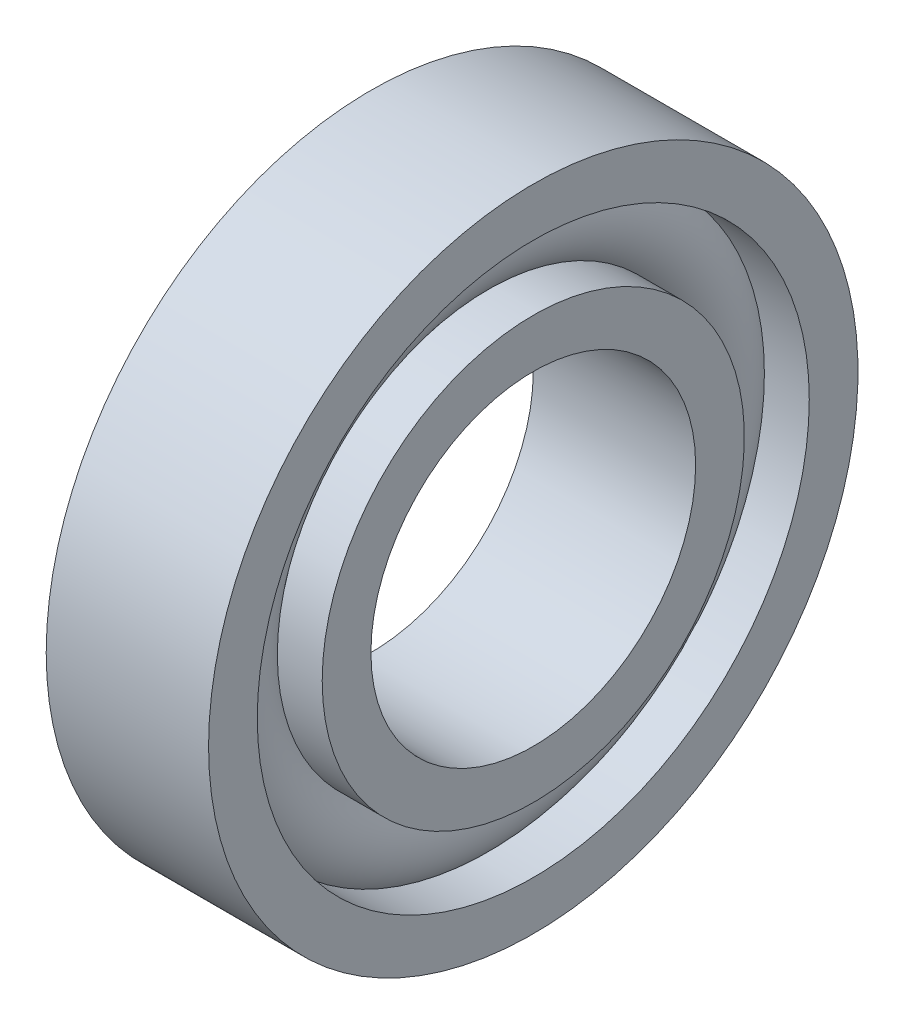
ISO-10303-21;
HEADER;
FILE_DESCRIPTION(('STEP AP214'),'2;1');
FILE_NAME('part.step','',(''),(''),'','','');
FILE_SCHEMA(('AUTOMOTIVE_DESIGN { 1 0 10303 214 1 1 1 1 }'));
ENDSEC;
DATA;
#1=APPLICATION_CONTEXT('core data for automotive mechanical design processes');
#2=APPLICATION_PROTOCOL_DEFINITION('international standard','automotive_design',2000,#1);
#3=PRODUCT_CONTEXT('',#1,'mechanical');
#4=PRODUCT('Part','Part','',(#3));
#5=PRODUCT_RELATED_PRODUCT_CATEGORY('part','',(#4));
#6=PRODUCT_DEFINITION_FORMATION('','',#4);
#7=PRODUCT_DEFINITION_CONTEXT('part definition',#1,'design');
#8=PRODUCT_DEFINITION('design','',#6,#7);
#9=PRODUCT_DEFINITION_SHAPE('','',#8);
#10=(LENGTH_UNIT() NAMED_UNIT(*) SI_UNIT(.MILLI.,.METRE.));
#11=(NAMED_UNIT(*) PLANE_ANGLE_UNIT() SI_UNIT($,.RADIAN.));
#12=(NAMED_UNIT(*) SI_UNIT($,.STERADIAN.) SOLID_ANGLE_UNIT());
#13=UNCERTAINTY_MEASURE_WITH_UNIT(LENGTH_MEASURE(1.E-05),#10,'distance_accuracy_value','');
#14=(GEOMETRIC_REPRESENTATION_CONTEXT(3) GLOBAL_UNCERTAINTY_ASSIGNED_CONTEXT((#13)) GLOBAL_UNIT_ASSIGNED_CONTEXT((#10,
#11,#12)) REPRESENTATION_CONTEXT('',''));
#15=CARTESIAN_POINT('',(0.,0.,0.));
#16=DIRECTION('',(0.,0.,1.));
#17=DIRECTION('',(1.,0.,0.));
#18=AXIS2_PLACEMENT_3D('',#15,#16,#17);
#19=CARTESIAN_POINT('',(-2.,4.,0.));
#20=DIRECTION('',(1.,0.,0.));
#21=DIRECTION('',(0.,0.,-1.));
#22=AXIS2_PLACEMENT_3D('',#19,#20,#21);
#23=PLANE('',#22);
#24=CARTESIAN_POINT('',(-2.,0.,0.));
#25=DIRECTION('',(-1.,0.,0.));
#26=DIRECTION('',(0.,0.,1.));
#27=AXIS2_PLACEMENT_3D('',#24,#25,#26);
#28=CIRCLE('',#27,4.);
#29=CARTESIAN_POINT('',(-2.,0.,4.));
#30=VERTEX_POINT('',#29);
#31=EDGE_CURVE('E72',#30,#30,#28,.T.);
#32=ORIENTED_EDGE('',*,*,#31,.F.);
#33=EDGE_LOOP('',(#32));
#34=FACE_BOUND('',#33,.T.);
#35=CARTESIAN_POINT('',(-2.,0.,0.));
#36=DIRECTION('',(-1.,0.,0.));
#37=DIRECTION('',(0.,0.,1.));
#38=AXIS2_PLACEMENT_3D('',#35,#36,#37);
#39=CIRCLE('',#38,5.2);
#40=CARTESIAN_POINT('',(-2.,0.,5.2));
#41=VERTEX_POINT('',#40);
#42=EDGE_CURVE('E10',#41,#41,#39,.T.);
#43=ORIENTED_EDGE('',*,*,#42,.T.);
#44=EDGE_LOOP('',(#43));
#45=FACE_BOUND('',#44,.T.);
#46=ADVANCED_FACE('F32',(#34,#45),#23,.F.);
#47=CARTESIAN_POINT('',(-2.,0.,0.));
#48=DIRECTION('',(-1.,0.,0.));
#49=DIRECTION('',(0.,0.,1.));
#50=AXIS2_PLACEMENT_3D('',#47,#48,#49);
#51=CYLINDRICAL_SURFACE('',#50,5.2);
#52=ORIENTED_EDGE('',*,*,#42,.F.);
#53=EDGE_LOOP('',(#52));
#54=FACE_BOUND('',#53,.T.);
#55=CARTESIAN_POINT('',(-0.894427190999911,0.,0.));
#56=DIRECTION('',(-1.,0.,0.));
#57=DIRECTION('',(0.,0.,1.));
#58=AXIS2_PLACEMENT_3D('',#55,#56,#57);
#59=CIRCLE('',#58,5.19999999999999);
#60=CARTESIAN_POINT('',(-0.894427190999911,0.,5.19999999999999));
#61=VERTEX_POINT('',#60);
#62=EDGE_CURVE('E38',#61,#61,#59,.T.);
#63=ORIENTED_EDGE('',*,*,#62,.T.);
#64=EDGE_LOOP('',(#63));
#65=FACE_BOUND('',#64,.T.);
#66=ADVANCED_FACE('F79',(#54,#65),#51,.T.);
#67=CARTESIAN_POINT('',(0.,0.,0.));
#68=DIRECTION('',(-1.,0.,0.));
#69=DIRECTION('',(0.,0.,1.));
#70=AXIS2_PLACEMENT_3D('',#67,#68,#69);
#71=TOROIDAL_SURFACE('',#70,6.,1.2);
#72=ORIENTED_EDGE('',*,*,#62,.F.);
#73=EDGE_LOOP('',(#72));
#74=FACE_BOUND('',#73,.T.);
#75=CARTESIAN_POINT('',(-0.894427190999912,0.,0.));
#76=DIRECTION('',(-1.,0.,0.));
#77=DIRECTION('',(0.,0.,1.));
#78=AXIS2_PLACEMENT_3D('',#75,#76,#77);
#79=CIRCLE('',#78,6.80000000000001);
#80=CARTESIAN_POINT('',(-0.894427190999912,0.,6.80000000000001));
#81=VERTEX_POINT('',#80);
#82=EDGE_CURVE('E42',#81,#81,#79,.T.);
#83=ORIENTED_EDGE('',*,*,#82,.T.);
#84=EDGE_LOOP('',(#83));
#85=FACE_BOUND('',#84,.T.);
#86=ADVANCED_FACE('F83',(#74,#85),#71,.T.);
#87=CARTESIAN_POINT('',(-2.,0.,0.));
#88=DIRECTION('',(-1.,0.,0.));
#89=DIRECTION('',(0.,0.,1.));
#90=AXIS2_PLACEMENT_3D('',#87,#88,#89);
#91=CYLINDRICAL_SURFACE('',#90,6.8);
#92=ORIENTED_EDGE('',*,*,#82,.F.);
#93=EDGE_LOOP('',(#92));
#94=FACE_BOUND('',#93,.T.);
#95=CARTESIAN_POINT('',(-2.,0.,0.));
#96=DIRECTION('',(-1.,0.,0.));
#97=DIRECTION('',(0.,0.,1.));
#98=AXIS2_PLACEMENT_3D('',#95,#96,#97);
#99=CIRCLE('',#98,6.8);
#100=CARTESIAN_POINT('',(-2.,0.,6.8));
#101=VERTEX_POINT('',#100);
#102=EDGE_CURVE('E46',#101,#101,#99,.T.);
#103=ORIENTED_EDGE('',*,*,#102,.T.);
#104=EDGE_LOOP('',(#103));
#105=FACE_BOUND('',#104,.T.);
#106=ADVANCED_FACE('F88',(#94,#105),#91,.F.);
#107=CARTESIAN_POINT('',(-2.,8.,0.));
#108=DIRECTION('',(1.,0.,0.));
#109=DIRECTION('',(0.,0.,-1.));
#110=AXIS2_PLACEMENT_3D('',#107,#108,#109);
#111=PLANE('',#110);
#112=ORIENTED_EDGE('',*,*,#102,.F.);
#113=EDGE_LOOP('',(#112));
#114=FACE_BOUND('',#113,.T.);
#115=CARTESIAN_POINT('',(-2.,0.,0.));
#116=DIRECTION('',(-1.,0.,0.));
#117=DIRECTION('',(0.,0.,1.));
#118=AXIS2_PLACEMENT_3D('',#115,#116,#117);
#119=CIRCLE('',#118,8.);
#120=CARTESIAN_POINT('',(-2.,0.,8.));
#121=VERTEX_POINT('',#120);
#122=EDGE_CURVE('E51',#121,#121,#119,.T.);
#123=ORIENTED_EDGE('',*,*,#122,.T.);
#124=EDGE_LOOP('',(#123));
#125=FACE_BOUND('',#124,.T.);
#126=ADVANCED_FACE('F94',(#114,#125),#111,.F.);
#127=CARTESIAN_POINT('',(-2.,0.,0.));
#128=DIRECTION('',(-1.,0.,0.));
#129=DIRECTION('',(0.,0.,1.));
#130=AXIS2_PLACEMENT_3D('',#127,#128,#129);
#131=CYLINDRICAL_SURFACE('',#130,8.);
#132=ORIENTED_EDGE('',*,*,#122,.F.);
#133=EDGE_LOOP('',(#132));
#134=FACE_BOUND('',#133,.T.);
#135=CARTESIAN_POINT('',(2.,0.,0.));
#136=DIRECTION('',(-1.,0.,0.));
#137=DIRECTION('',(0.,0.,1.));
#138=AXIS2_PLACEMENT_3D('',#135,#136,#137);
#139=CIRCLE('',#138,8.);
#140=CARTESIAN_POINT('',(2.,0.,8.));
#141=VERTEX_POINT('',#140);
#142=EDGE_CURVE('E54',#141,#141,#139,.T.);
#143=ORIENTED_EDGE('',*,*,#142,.T.);
#144=EDGE_LOOP('',(#143));
#145=FACE_BOUND('',#144,.T.);
#146=ADVANCED_FACE('F98',(#134,#145),#131,.T.);
#147=CARTESIAN_POINT('',(2.,8.,0.));
#148=DIRECTION('',(-1.,0.,0.));
#149=DIRECTION('',(0.,0.,1.));
#150=AXIS2_PLACEMENT_3D('',#147,#148,#149);
#151=PLANE('',#150);
#152=ORIENTED_EDGE('',*,*,#142,.F.);
#153=EDGE_LOOP('',(#152));
#154=FACE_BOUND('',#153,.T.);
#155=CARTESIAN_POINT('',(2.,0.,0.));
#156=DIRECTION('',(-1.,0.,0.));
#157=DIRECTION('',(0.,0.,1.));
#158=AXIS2_PLACEMENT_3D('',#155,#156,#157);
#159=CIRCLE('',#158,6.8);
#160=CARTESIAN_POINT('',(2.,0.,6.8));
#161=VERTEX_POINT('',#160);
#162=EDGE_CURVE('E57',#161,#161,#159,.T.);
#163=ORIENTED_EDGE('',*,*,#162,.T.);
#164=EDGE_LOOP('',(#163));
#165=FACE_BOUND('',#164,.T.);
#166=ADVANCED_FACE('F102',(#154,#165),#151,.F.);
#167=CARTESIAN_POINT('',(-2.,0.,0.));
#168=DIRECTION('',(-1.,0.,0.));
#169=DIRECTION('',(0.,0.,1.));
#170=AXIS2_PLACEMENT_3D('',#167,#168,#169);
#171=CYLINDRICAL_SURFACE('',#170,6.80000000000001);
#172=ORIENTED_EDGE('',*,*,#162,.F.);
#173=EDGE_LOOP('',(#172));
#174=FACE_BOUND('',#173,.T.);
#175=CARTESIAN_POINT('',(0.894427190999912,0.,0.));
#176=DIRECTION('',(-1.,0.,0.));
#177=DIRECTION('',(0.,0.,1.));
#178=AXIS2_PLACEMENT_3D('',#175,#176,#177);
#179=CIRCLE('',#178,6.80000000000001);
#180=CARTESIAN_POINT('',(0.894427190999912,0.,6.80000000000001));
#181=VERTEX_POINT('',#180);
#182=EDGE_CURVE('E60',#181,#181,#179,.T.);
#183=ORIENTED_EDGE('',*,*,#182,.T.);
#184=EDGE_LOOP('',(#183));
#185=FACE_BOUND('',#184,.T.);
#186=ADVANCED_FACE('F106',(#174,#185),#171,.F.);
#187=CARTESIAN_POINT('',(0.,0.,0.));
#188=DIRECTION('',(-1.,0.,0.));
#189=DIRECTION('',(0.,0.,1.));
#190=AXIS2_PLACEMENT_3D('',#187,#188,#189);
#191=TOROIDAL_SURFACE('',#190,6.,1.2);
#192=ORIENTED_EDGE('',*,*,#182,.F.);
#193=EDGE_LOOP('',(#192));
#194=FACE_BOUND('',#193,.T.);
#195=CARTESIAN_POINT('',(0.894427190999912,0.,0.));
#196=DIRECTION('',(-1.,0.,0.));
#197=DIRECTION('',(0.,0.,1.));
#198=AXIS2_PLACEMENT_3D('',#195,#196,#197);
#199=CIRCLE('',#198,5.2);
#200=CARTESIAN_POINT('',(0.894427190999912,0.,5.2));
#201=VERTEX_POINT('',#200);
#202=EDGE_CURVE('E63',#201,#201,#199,.T.);
#203=ORIENTED_EDGE('',*,*,#202,.T.);
#204=EDGE_LOOP('',(#203));
#205=FACE_BOUND('',#204,.T.);
#206=ADVANCED_FACE('F110',(#194,#205),#191,.T.);
#207=CARTESIAN_POINT('',(-2.,0.,0.));
#208=DIRECTION('',(-1.,0.,0.));
#209=DIRECTION('',(0.,0.,1.));
#210=AXIS2_PLACEMENT_3D('',#207,#208,#209);
#211=CYLINDRICAL_SURFACE('',#210,5.2);
#212=ORIENTED_EDGE('',*,*,#202,.F.);
#213=EDGE_LOOP('',(#212));
#214=FACE_BOUND('',#213,.T.);
#215=CARTESIAN_POINT('',(2.,0.,0.));
#216=DIRECTION('',(-1.,0.,0.));
#217=DIRECTION('',(0.,0.,1.));
#218=AXIS2_PLACEMENT_3D('',#215,#216,#217);
#219=CIRCLE('',#218,5.2);
#220=CARTESIAN_POINT('',(2.,0.,5.2));
#221=VERTEX_POINT('',#220);
#222=EDGE_CURVE('E66',#221,#221,#219,.T.);
#223=ORIENTED_EDGE('',*,*,#222,.T.);
#224=EDGE_LOOP('',(#223));
#225=FACE_BOUND('',#224,.T.);
#226=ADVANCED_FACE('F114',(#214,#225),#211,.T.);
#227=CARTESIAN_POINT('',(2.,4.,0.));
#228=DIRECTION('',(-1.,0.,0.));
#229=DIRECTION('',(0.,0.,1.));
#230=AXIS2_PLACEMENT_3D('',#227,#228,#229);
#231=PLANE('',#230);
#232=ORIENTED_EDGE('',*,*,#222,.F.);
#233=EDGE_LOOP('',(#232));
#234=FACE_BOUND('',#233,.T.);
#235=CARTESIAN_POINT('',(2.,0.,0.));
#236=DIRECTION('',(-1.,0.,0.));
#237=DIRECTION('',(0.,0.,1.));
#238=AXIS2_PLACEMENT_3D('',#235,#236,#237);
#239=CIRCLE('',#238,4.);
#240=CARTESIAN_POINT('',(2.,0.,4.));
#241=VERTEX_POINT('',#240);
#242=EDGE_CURVE('E69',#241,#241,#239,.T.);
#243=ORIENTED_EDGE('',*,*,#242,.T.);
#244=EDGE_LOOP('',(#243));
#245=FACE_BOUND('',#244,.T.);
#246=ADVANCED_FACE('F118',(#234,#245),#231,.F.);
#247=CARTESIAN_POINT('',(-2.,0.,0.));
#248=DIRECTION('',(-1.,0.,0.));
#249=DIRECTION('',(0.,0.,1.));
#250=AXIS2_PLACEMENT_3D('',#247,#248,#249);
#251=CYLINDRICAL_SURFACE('',#250,4.);
#252=ORIENTED_EDGE('',*,*,#242,.F.);
#253=EDGE_LOOP('',(#252));
#254=FACE_BOUND('',#253,.T.);
#255=ORIENTED_EDGE('',*,*,#31,.T.);
#256=EDGE_LOOP('',(#255));
#257=FACE_BOUND('',#256,.T.);
#258=ADVANCED_FACE('F76',(#254,#257),#251,.F.);
#259=CLOSED_SHELL('',(#46,#66,#86,#106,#126,#146,#166,#186,#206,#226,#246,#258));
#260=MANIFOLD_SOLID_BREP('B2',#259);
#261=ADVANCED_BREP_SHAPE_REPRESENTATION('',(#18,#260),#14);
#262=SHAPE_DEFINITION_REPRESENTATION(#9,#261);
ENDSEC;
END-ISO-10303-21;
